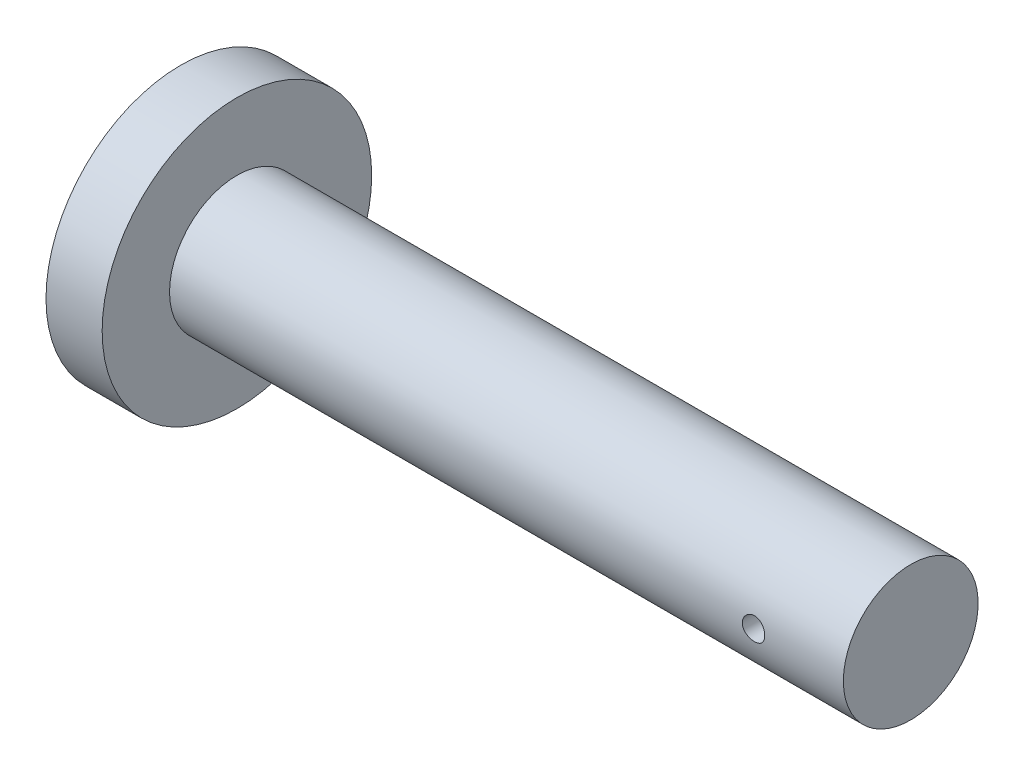
ISO-10303-21;
HEADER;
FILE_DESCRIPTION(('STEP AP214'),'2;1');
FILE_NAME('part.step','',(''),(''),'','','');
FILE_SCHEMA(('AUTOMOTIVE_DESIGN { 1 0 10303 214 1 1 1 1 }'));
ENDSEC;
DATA;
#1=APPLICATION_CONTEXT('core data for automotive mechanical design processes');
#2=APPLICATION_PROTOCOL_DEFINITION('international standard','automotive_design',2000,#1);
#3=PRODUCT_CONTEXT('',#1,'mechanical');
#4=PRODUCT('Part','Part','',(#3));
#5=PRODUCT_RELATED_PRODUCT_CATEGORY('part','',(#4));
#6=PRODUCT_DEFINITION_FORMATION('','',#4);
#7=PRODUCT_DEFINITION_CONTEXT('part definition',#1,'design');
#8=PRODUCT_DEFINITION('design','',#6,#7);
#9=PRODUCT_DEFINITION_SHAPE('','',#8);
#10=(LENGTH_UNIT() NAMED_UNIT(*) SI_UNIT(.MILLI.,.METRE.));
#11=(NAMED_UNIT(*) PLANE_ANGLE_UNIT() SI_UNIT($,.RADIAN.));
#12=(NAMED_UNIT(*) SI_UNIT($,.STERADIAN.) SOLID_ANGLE_UNIT());
#13=UNCERTAINTY_MEASURE_WITH_UNIT(LENGTH_MEASURE(1.E-05),#10,'distance_accuracy_value','');
#14=(GEOMETRIC_REPRESENTATION_CONTEXT(3) GLOBAL_UNCERTAINTY_ASSIGNED_CONTEXT((#13)) GLOBAL_UNIT_ASSIGNED_CONTEXT((#10,
#11,#12)) REPRESENTATION_CONTEXT('',''));
#15=CARTESIAN_POINT('',(0.,0.,0.));
#16=DIRECTION('',(0.,0.,1.));
#17=DIRECTION('',(1.,0.,0.));
#18=AXIS2_PLACEMENT_3D('',#15,#16,#17);
#19=CARTESIAN_POINT('',(0.,0.,0.));
#20=DIRECTION('',(-1.,0.,0.));
#21=DIRECTION('',(0.,0.,1.));
#22=AXIS2_PLACEMENT_3D('',#19,#20,#21);
#23=CYLINDRICAL_SURFACE('',#22,12.);
#24=CARTESIAN_POINT('',(-27.9859154929612,0.,0.));
#25=DIRECTION('',(-1.,0.,0.));
#26=DIRECTION('',(0.,0.,1.));
#27=AXIS2_PLACEMENT_3D('',#24,#25,#26);
#28=CIRCLE('',#27,12.);
#29=CARTESIAN_POINT('',(-27.9859154929612,0.,12.));
#30=VERTEX_POINT('',#29);
#31=EDGE_CURVE('E87',#30,#30,#28,.T.);
#32=ORIENTED_EDGE('',*,*,#31,.F.);
#33=EDGE_LOOP('',(#32));
#34=FACE_BOUND('',#33,.T.);
#35=CARTESIAN_POINT('',(-22.9859154929612,0.,0.));
#36=DIRECTION('',(-1.,0.,0.));
#37=DIRECTION('',(0.,0.,1.));
#38=AXIS2_PLACEMENT_3D('',#35,#36,#37);
#39=CIRCLE('',#38,12.);
#40=CARTESIAN_POINT('',(-22.9859154929612,0.,12.));
#41=VERTEX_POINT('',#40);
#42=EDGE_CURVE('E10',#41,#41,#39,.T.);
#43=ORIENTED_EDGE('',*,*,#42,.T.);
#44=EDGE_LOOP('',(#43));
#45=FACE_BOUND('',#44,.T.);
#46=ADVANCED_FACE('F33',(#34,#45),#23,.T.);
#47=CARTESIAN_POINT('',(-22.9859154929612,12.,0.));
#48=DIRECTION('',(-1.,0.,0.));
#49=DIRECTION('',(0.,0.,1.));
#50=AXIS2_PLACEMENT_3D('',#47,#48,#49);
#51=PLANE('',#50);
#52=ORIENTED_EDGE('',*,*,#42,.F.);
#53=EDGE_LOOP('',(#52));
#54=FACE_BOUND('',#53,.T.);
#55=CARTESIAN_POINT('',(-22.9859154929612,0.,0.));
#56=DIRECTION('',(-1.,0.,0.));
#57=DIRECTION('',(0.,0.,1.));
#58=AXIS2_PLACEMENT_3D('',#55,#56,#57);
#59=CIRCLE('',#58,6.);
#60=CARTESIAN_POINT('',(-22.9859154929612,0.,6.));
#61=VERTEX_POINT('',#60);
#62=EDGE_CURVE('E45',#61,#61,#59,.T.);
#63=ORIENTED_EDGE('',*,*,#62,.T.);
#64=EDGE_LOOP('',(#63));
#65=FACE_BOUND('',#64,.T.);
#66=ADVANCED_FACE('F76',(#54,#65),#51,.F.);
#67=CARTESIAN_POINT('',(0.,0.,0.));
#68=DIRECTION('',(-1.,0.,0.));
#69=DIRECTION('',(0.,0.,1.));
#70=AXIS2_PLACEMENT_3D('',#67,#68,#69);
#71=CYLINDRICAL_SURFACE('',#70,6.);
#72=CARTESIAN_POINT('',(30.0140845070388,0.,6.));
#73=CARTESIAN_POINT('',(30.0140822714596,-0.0557563619832857,5.99999904467529));
#74=CARTESIAN_POINT('',(30.0094055970512,-0.111543152735528,5.99921471165214));
#75=CARTESIAN_POINT('',(29.9908302435326,-0.221552088669217,5.99616137976555));
#76=CARTESIAN_POINT('',(29.9769230842741,-0.275772747183699,5.99389101569556));
#77=CARTESIAN_POINT('',(29.9403183276017,-0.381041898885059,5.9881202729458));
#78=CARTESIAN_POINT('',(29.9176279207825,-0.432092947372762,5.98462090063677));
#79=CARTESIAN_POINT('',(29.8641195902178,-0.52965673679118,5.97677690832828));
#80=CARTESIAN_POINT('',(29.8333025960456,-0.576169995951438,5.97243238501774));
#81=CARTESIAN_POINT('',(29.7641024735106,-0.663789045716673,5.96333326983325));
#82=CARTESIAN_POINT('',(29.7256568611843,-0.704845161413988,5.95857548725943));
#83=CARTESIAN_POINT('',(29.6424253196496,-0.779955399463972,5.94921050750693));
#84=CARTESIAN_POINT('',(29.5976389904561,-0.814009079756389,5.94460331985067));
#85=CARTESIAN_POINT('',(29.5026561205599,-0.874346850242053,5.93603026303912));
#86=CARTESIAN_POINT('',(29.4524279723169,-0.900581821144401,5.93206851636654));
#87=CARTESIAN_POINT('',(29.3482006813185,-0.944223346164488,5.9252791591787));
#88=CARTESIAN_POINT('',(29.2942017935677,-0.961630496626246,5.92245147205723));
#89=CARTESIAN_POINT('',(29.1844923970961,-0.986965751113925,5.91828214737102));
#90=CARTESIAN_POINT('',(29.1288022124382,-0.994979611654162,5.9169270739428));
#91=CARTESIAN_POINT('',(29.0168523962854,-1.00156669011595,5.9158157557466));
#92=CARTESIAN_POINT('',(28.9605928053718,-1.0001405761556,5.91605939782886));
#93=CARTESIAN_POINT('',(28.8497133625286,-0.987958039358463,5.91810571545422));
#94=CARTESIAN_POINT('',(28.7950825856207,-0.97729795275591,5.91989229327567));
#95=CARTESIAN_POINT('',(28.6883959799071,-0.947101256161379,5.92479798084403));
#96=CARTESIAN_POINT('',(28.6363402394833,-0.927564341727898,5.92791713629309));
#97=CARTESIAN_POINT('',(28.5359929776624,-0.880070898437567,5.9351539173364));
#98=CARTESIAN_POINT('',(28.4877207446063,-0.852074365551888,5.9392762684293));
#99=CARTESIAN_POINT('',(28.3965227468234,-0.788484807022975,5.94805167366003));
#100=CARTESIAN_POINT('',(28.3535974140568,-0.752891168261716,5.95270477061714));
#101=CARTESIAN_POINT('',(28.2737540727158,-0.674592884863623,5.96208811151914));
#102=CARTESIAN_POINT('',(28.2369170996227,-0.631805585549252,5.96681859692661));
#103=CARTESIAN_POINT('',(28.1709334019726,-0.54061409959266,5.97577040558689));
#104=CARTESIAN_POINT('',(28.1417867269655,-0.492209876762569,5.97999172555898));
#105=CARTESIAN_POINT('',(28.0920036161842,-0.391082366466685,5.98745557157165));
#106=CARTESIAN_POINT('',(28.0713743393063,-0.338355490225865,5.99069727362979));
#107=CARTESIAN_POINT('',(28.0392868209404,-0.230119338241094,5.99583001205064));
#108=CARTESIAN_POINT('',(28.0278278122493,-0.174610295671789,5.9977211614019));
#109=CARTESIAN_POINT('',(28.0145159636543,-0.0630839605206509,5.99992451937074));
#110=CARTESIAN_POINT('',(28.0125518783165,-0.00708029486040566,6.00025501205114));
#111=CARTESIAN_POINT('',(28.01798904481,0.104455909155954,5.99934989768468));
#112=CARTESIAN_POINT('',(28.0253899362923,0.159988465556816,5.99811435089647));
#113=CARTESIAN_POINT('',(28.0492544467729,0.268662470218706,5.99422730775281));
#114=CARTESIAN_POINT('',(28.0656629903948,0.321816347354152,5.99158441920524));
#115=CARTESIAN_POINT('',(28.1070183143186,0.424618753944178,5.98517785782143));
#116=CARTESIAN_POINT('',(28.1319655740929,0.474267086363889,5.98141412204808));
#117=CARTESIAN_POINT('',(28.1899449569175,0.569132275787585,5.97313806520963));
#118=CARTESIAN_POINT('',(28.2230465695057,0.614306100374861,5.96861942354809));
#119=CARTESIAN_POINT('',(28.2962994331928,0.698497434201076,5.9593538695676));
#120=CARTESIAN_POINT('',(28.3364511963494,0.737514495878634,5.95460694068619));
#121=CARTESIAN_POINT('',(28.4231635262673,0.808697111863203,5.94536070094338));
#122=CARTESIAN_POINT('',(28.4697861732445,0.84078750444549,5.94086446454842));
#123=CARTESIAN_POINT('',(28.5678256946942,0.896680924117997,5.93268611911154));
#124=CARTESIAN_POINT('',(28.6192424171298,0.920484213907931,5.92900398426408));
#125=CARTESIAN_POINT('',(28.7252004001636,0.959015332589262,5.92289381479082));
#126=CARTESIAN_POINT('',(28.779727745051,0.973780573019181,5.92046061724426));
#127=CARTESIAN_POINT('',(28.8905325587275,0.993934181511313,5.91711086734104));
#128=CARTESIAN_POINT('',(28.9468098749316,0.999323364778469,5.91619418313089));
#129=CARTESIAN_POINT('',(29.0587665734237,1.00054914641894,5.91598693233605));
#130=CARTESIAN_POINT('',(29.1144446584689,0.996504054450076,5.9166762260226));
#131=CARTESIAN_POINT('',(29.2243162062591,0.97923193558274,5.91955912581491));
#132=CARTESIAN_POINT('',(29.2785096738155,0.966004938444992,5.92175272704486));
#133=CARTESIAN_POINT('',(29.3838278819558,0.930789795837962,5.92738942512687));
#134=CARTESIAN_POINT('',(29.4349561110612,0.908811836240179,5.93083106887868));
#135=CARTESIAN_POINT('',(29.5328187747167,0.856730801566366,5.93857747568883));
#136=CARTESIAN_POINT('',(29.5795529911876,0.826627323499428,5.9428822815536));
#137=CARTESIAN_POINT('',(29.6678987402819,0.758727553748865,5.95193381618249));
#138=CARTESIAN_POINT('',(29.7094429137189,0.720844225437461,5.95668518230521));
#139=CARTESIAN_POINT('',(29.7856251488287,0.638643612552094,5.96605748944336));
#140=CARTESIAN_POINT('',(29.820261614494,0.594324845165056,5.97067840010619));
#141=CARTESIAN_POINT('',(29.8818638143187,0.500147667856115,5.97930611856888));
#142=CARTESIAN_POINT('',(29.9087749227639,0.450253115013129,5.98330846501242));
#143=CARTESIAN_POINT('',(29.9537923008827,0.346605227751594,5.9902046704071));
#144=CARTESIAN_POINT('',(29.9719073394706,0.292855797932006,5.99309963270993));
#145=CARTESIAN_POINT('',(29.9948866166894,0.199081324018161,5.99682316333182));
#146=CARTESIAN_POINT('',(30.0020742948851,0.15962353211938,5.99800810909344));
#147=CARTESIAN_POINT('',(30.0116740021767,0.0801157241279236,5.99959686394448));
#148=CARTESIAN_POINT('',(30.0140861134937,0.0400657182433977,6.00000068648257));
#149=CARTESIAN_POINT('',(30.0140845070388,0.,6.));
#150=B_SPLINE_CURVE_WITH_KNOTS('',3,(#72,#73,#74,#75,#76,#77,#78,#79,#80,#81,#82,#83,#84,#85,
#86,#87,#88,#89,#90,#91,#92,#93,#94,#95,#96,#97,#98,#99,#100,#101,#102,#103,#104,#105,#106,#107,
#108,#109,#110,#111,#112,#113,#114,#115,#116,#117,#118,#119,#120,#121,#122,#123,#124,#125,#126,
#127,#128,#129,#130,#131,#132,#133,#134,#135,#136,#137,#138,#139,#140,#141,#142,#143,#144,#145,
#146,#147,#148,#149),.UNSPECIFIED.,.T.,.F.,(4,2,2,2,2,2,2,2,2,2,2,2,2,2,2,2,2,2,2,2,2,2,2,2,2,2,
2,2,2,2,2,2,2,2,2,2,2,2,4),(0.,0.167122633975404,0.33439901827817,0.501538746810112,
0.668659365069919,0.83720996424933,1.00577120067943,1.17537008329536,1.34495750750473,
1.5129843084137,1.68099921728355,1.84728208704164,2.01357066010153,2.18065822653023,
2.3477592827223,2.51693107964531,2.6861039665434,2.85541875566362,3.0247193780846,
3.19203153396559,3.35933725214344,3.52563122802567,3.69193454330427,3.8597073025081,
4.02749225221714,4.19701528803049,4.36653294950378,4.5353440893671,4.70414055114648,
4.87083163809081,5.03752218475254,5.2040192729049,5.37052462011735,5.53900553677358,
5.7075253355159,5.87720892642881,6.0467230085203,6.16681699265608,6.28690890910788),.UNSPECIFIED.);
#151=CARTESIAN_POINT('',(30.0140845070388,0.,6.));
#152=VERTEX_POINT('',#151);
#153=EDGE_CURVE('E36',#152,#152,#150,.T.);
#154=ORIENTED_EDGE('',*,*,#153,.T.);
#155=EDGE_LOOP('',(#154));
#156=FACE_BOUND('',#155,.T.);
#157=CARTESIAN_POINT('',(30.0140845070388,0.,-6.));
#158=CARTESIAN_POINT('',(30.0140822714596,0.0557563619832862,-5.99999904467529));
#159=CARTESIAN_POINT('',(30.0094055970512,0.111543152735529,-5.99921471165214));
#160=CARTESIAN_POINT('',(29.9908302435326,0.221552088669218,-5.99616137976555));
#161=CARTESIAN_POINT('',(29.9769230842741,0.275772747183699,-5.99389101569556));
#162=CARTESIAN_POINT('',(29.9403183276017,0.381041898885057,-5.9881202729458));
#163=CARTESIAN_POINT('',(29.9176279207825,0.43209294737276,-5.98462090063677));
#164=CARTESIAN_POINT('',(29.8641195902178,0.529656736791178,-5.97677690832828));
#165=CARTESIAN_POINT('',(29.8333025960456,0.576169995951436,-5.97243238501774));
#166=CARTESIAN_POINT('',(29.7641024735106,0.663789045716673,-5.96333326983325));
#167=CARTESIAN_POINT('',(29.7256568611843,0.704845161413988,-5.95857548725943));
#168=CARTESIAN_POINT('',(29.6424253196496,0.779955399463972,-5.94921050750693));
#169=CARTESIAN_POINT('',(29.5976389904561,0.814009079756389,-5.94460331985067));
#170=CARTESIAN_POINT('',(29.5026561205599,0.874346850242053,-5.93603026303912));
#171=CARTESIAN_POINT('',(29.4524279723169,0.900581821144401,-5.93206851636654));
#172=CARTESIAN_POINT('',(29.3482006813185,0.944223346164488,-5.9252791591787));
#173=CARTESIAN_POINT('',(29.2942017935677,0.961630496626246,-5.92245147205723));
#174=CARTESIAN_POINT('',(29.1844923970961,0.986965751113925,-5.91828214737102));
#175=CARTESIAN_POINT('',(29.1288022124382,0.994979611654162,-5.9169270739428));
#176=CARTESIAN_POINT('',(29.0168523962854,1.00156669011595,-5.9158157557466));
#177=CARTESIAN_POINT('',(28.9605928053718,1.0001405761556,-5.91605939782886));
#178=CARTESIAN_POINT('',(28.8497133625286,0.987958039358462,-5.91810571545422));
#179=CARTESIAN_POINT('',(28.7950825856207,0.97729795275591,-5.91989229327567));
#180=CARTESIAN_POINT('',(28.6883959799071,0.947101256161379,-5.92479798084403));
#181=CARTESIAN_POINT('',(28.6363402394833,0.927564341727898,-5.92791713629309));
#182=CARTESIAN_POINT('',(28.5359929776624,0.880070898437567,-5.9351539173364));
#183=CARTESIAN_POINT('',(28.4877207446063,0.852074365551888,-5.9392762684293));
#184=CARTESIAN_POINT('',(28.3965227468234,0.788484807022975,-5.94805167366003));
#185=CARTESIAN_POINT('',(28.3535974140568,0.752891168261716,-5.95270477061714));
#186=CARTESIAN_POINT('',(28.2737540727158,0.674592884863623,-5.96208811151914));
#187=CARTESIAN_POINT('',(28.2369170996227,0.631805585549252,-5.96681859692661));
#188=CARTESIAN_POINT('',(28.1709334019726,0.54061409959266,-5.97577040558689));
#189=CARTESIAN_POINT('',(28.1417867269655,0.492209876762569,-5.97999172555898));
#190=CARTESIAN_POINT('',(28.0920036161842,0.391082366466685,-5.98745557157165));
#191=CARTESIAN_POINT('',(28.0713743393063,0.338355490225865,-5.99069727362979));
#192=CARTESIAN_POINT('',(28.0392868209404,0.230119338241094,-5.99583001205064));
#193=CARTESIAN_POINT('',(28.0278278122493,0.174610295671789,-5.9977211614019));
#194=CARTESIAN_POINT('',(28.0145159636543,0.063083960520651,-5.99992451937074));
#195=CARTESIAN_POINT('',(28.0125518783165,0.00708029486040593,-6.00025501205114));
#196=CARTESIAN_POINT('',(28.01798904481,-0.104455909155954,-5.99934989768468));
#197=CARTESIAN_POINT('',(28.0253899362923,-0.159988465556815,-5.99811435089647));
#198=CARTESIAN_POINT('',(28.0492544467729,-0.268662470218705,-5.99422730775281));
#199=CARTESIAN_POINT('',(28.0656629903948,-0.321816347354151,-5.99158441920524));
#200=CARTESIAN_POINT('',(28.1070183143186,-0.424618753944176,-5.98517785782143));
#201=CARTESIAN_POINT('',(28.1319655740929,-0.474267086363888,-5.98141412204808));
#202=CARTESIAN_POINT('',(28.1899449569175,-0.569132275787584,-5.97313806520963));
#203=CARTESIAN_POINT('',(28.2230465695057,-0.614306100374859,-5.96861942354809));
#204=CARTESIAN_POINT('',(28.2962994331928,-0.698497434201075,-5.9593538695676));
#205=CARTESIAN_POINT('',(28.3364511963494,-0.737514495878634,-5.95460694068619));
#206=CARTESIAN_POINT('',(28.4231635262673,-0.808697111863201,-5.94536070094338));
#207=CARTESIAN_POINT('',(28.4697861732445,-0.840787504445487,-5.94086446454842));
#208=CARTESIAN_POINT('',(28.5678256946942,-0.896680924117995,-5.93268611911154));
#209=CARTESIAN_POINT('',(28.6192424171298,-0.92048421390793,-5.92900398426408));
#210=CARTESIAN_POINT('',(28.7252004001636,-0.95901533258926,-5.92289381479082));
#211=CARTESIAN_POINT('',(28.779727745051,-0.973780573019179,-5.92046061724426));
#212=CARTESIAN_POINT('',(28.8905325587275,-0.993934181511312,-5.91711086734104));
#213=CARTESIAN_POINT('',(28.9468098749316,-0.999323364778469,-5.91619418313089));
#214=CARTESIAN_POINT('',(29.0587665734237,-1.00054914641894,-5.91598693233605));
#215=CARTESIAN_POINT('',(29.1144446584689,-0.996504054450076,-5.9166762260226));
#216=CARTESIAN_POINT('',(29.2243162062591,-0.979231935582742,-5.91955912581491));
#217=CARTESIAN_POINT('',(29.2785096738155,-0.966004938444993,-5.92175272704486));
#218=CARTESIAN_POINT('',(29.3838278819558,-0.930789795837963,-5.92738942512687));
#219=CARTESIAN_POINT('',(29.4349561110612,-0.908811836240179,-5.93083106887868));
#220=CARTESIAN_POINT('',(29.5328187747167,-0.856730801566366,-5.93857747568883));
#221=CARTESIAN_POINT('',(29.5795529911876,-0.826627323499428,-5.9428822815536));
#222=CARTESIAN_POINT('',(29.6678987402819,-0.758727553748865,-5.95193381618249));
#223=CARTESIAN_POINT('',(29.7094429137189,-0.720844225437461,-5.95668518230521));
#224=CARTESIAN_POINT('',(29.7856251488287,-0.638643612552094,-5.96605748944336));
#225=CARTESIAN_POINT('',(29.820261614494,-0.594324845165056,-5.97067840010619));
#226=CARTESIAN_POINT('',(29.8818638143187,-0.500147667856115,-5.97930611856888));
#227=CARTESIAN_POINT('',(29.9087749227639,-0.450253115013129,-5.98330846501242));
#228=CARTESIAN_POINT('',(29.9537923008827,-0.346605227751594,-5.9902046704071));
#229=CARTESIAN_POINT('',(29.9719073394706,-0.292855797932006,-5.99309963270993));
#230=CARTESIAN_POINT('',(29.9948866166894,-0.199081324018162,-5.99682316333182));
#231=CARTESIAN_POINT('',(30.0020742948851,-0.15962353211938,-5.99800810909344));
#232=CARTESIAN_POINT('',(30.0116740021767,-0.0801157241279243,-5.99959686394448));
#233=CARTESIAN_POINT('',(30.0140861134937,-0.040065718243398,-6.00000068648257));
#234=CARTESIAN_POINT('',(30.0140845070388,0.,-6.));
#235=B_SPLINE_CURVE_WITH_KNOTS('',3,(#157,#158,#159,#160,#161,#162,#163,#164,#165,#166,#167,
#168,#169,#170,#171,#172,#173,#174,#175,#176,#177,#178,#179,#180,#181,#182,#183,#184,#185,#186,
#187,#188,#189,#190,#191,#192,#193,#194,#195,#196,#197,#198,#199,#200,#201,#202,#203,#204,#205,
#206,#207,#208,#209,#210,#211,#212,#213,#214,#215,#216,#217,#218,#219,#220,#221,#222,#223,#224,
#225,#226,#227,#228,#229,#230,#231,#232,#233,#234),.UNSPECIFIED.,.T.,.F.,(4,2,2,2,2,2,2,2,2,2,2,
2,2,2,2,2,2,2,2,2,2,2,2,2,2,2,2,2,2,2,2,2,2,2,2,2,2,2,4),(0.,0.167122633975404,
0.334399018278169,0.501538746810107,0.668659365069918,0.837209964249329,1.00577120067943,
1.17537008329536,1.34495750750473,1.5129843084137,1.68099921728355,1.84728208704164,
2.01357066010153,2.18065822653023,2.3477592827223,2.51693107964531,2.6861039665434,
2.85541875566362,3.0247193780846,3.19203153396559,3.35933725214344,3.52563122802567,
3.69193454330427,3.8597073025081,4.02749225221714,4.19701528803048,4.36653294950378,
4.53534408936709,4.70414055114647,4.8708316380908,5.03752218475254,5.2040192729049,
5.37052462011735,5.53900553677357,5.7075253355159,5.87720892642881,6.04672300852029,
6.16681699265608,6.28690890910788),.UNSPECIFIED.);
#236=CARTESIAN_POINT('',(30.0140845070388,0.,-6.));
#237=VERTEX_POINT('',#236);
#238=EDGE_CURVE('E53',#237,#237,#235,.T.);
#239=ORIENTED_EDGE('',*,*,#238,.T.);
#240=EDGE_LOOP('',(#239));
#241=FACE_BOUND('',#240,.T.);
#242=ORIENTED_EDGE('',*,*,#62,.F.);
#243=EDGE_LOOP('',(#242));
#244=FACE_BOUND('',#243,.T.);
#245=CARTESIAN_POINT('',(37.0140845070388,0.,0.));
#246=DIRECTION('',(-1.,0.,0.));
#247=DIRECTION('',(0.,0.,1.));
#248=AXIS2_PLACEMENT_3D('',#245,#246,#247);
#249=CIRCLE('',#248,6.);
#250=CARTESIAN_POINT('',(37.0140845070388,0.,6.));
#251=VERTEX_POINT('',#250);
#252=EDGE_CURVE('E50',#251,#251,#249,.T.);
#253=ORIENTED_EDGE('',*,*,#252,.T.);
#254=EDGE_LOOP('',(#253));
#255=FACE_BOUND('',#254,.T.);
#256=ADVANCED_FACE('F58',(#156,#241,#244,#255),#71,.T.);
#257=CARTESIAN_POINT('',(37.0140845070388,6.,0.));
#258=DIRECTION('',(-1.,0.,0.));
#259=DIRECTION('',(0.,0.,1.));
#260=AXIS2_PLACEMENT_3D('',#257,#258,#259);
#261=PLANE('',#260);
#262=ORIENTED_EDGE('',*,*,#252,.F.);
#263=EDGE_LOOP('',(#262));
#264=FACE_BOUND('',#263,.T.);
#265=ADVANCED_FACE('F69',(#264),#261,.F.);
#266=CARTESIAN_POINT('',(-27.9859154929612,12.,0.));
#267=DIRECTION('',(1.,0.,0.));
#268=DIRECTION('',(0.,0.,-1.));
#269=AXIS2_PLACEMENT_3D('',#266,#267,#268);
#270=PLANE('',#269);
#271=ORIENTED_EDGE('',*,*,#31,.T.);
#272=EDGE_LOOP('',(#271));
#273=FACE_BOUND('',#272,.T.);
#274=ADVANCED_FACE('F65',(#273),#270,.F.);
#275=CARTESIAN_POINT('',(29.0140845070388,0.,-12.));
#276=DIRECTION('',(0.,0.,1.));
#277=DIRECTION('',(1.,0.,0.));
#278=AXIS2_PLACEMENT_3D('',#275,#276,#277);
#279=CYLINDRICAL_SURFACE('',#278,1.);
#280=ORIENTED_EDGE('',*,*,#238,.F.);
#281=EDGE_LOOP('',(#280));
#282=FACE_BOUND('',#281,.T.);
#283=ORIENTED_EDGE('',*,*,#153,.F.);
#284=EDGE_LOOP('',(#283));
#285=FACE_BOUND('',#284,.T.);
#286=ADVANCED_FACE('F61',(#282,#285),#279,.F.);
#287=CLOSED_SHELL('',(#46,#66,#256,#265,#274,#286));
#288=MANIFOLD_SOLID_BREP('B2',#287);
#289=ADVANCED_BREP_SHAPE_REPRESENTATION('',(#18,#288),#14);
#290=SHAPE_DEFINITION_REPRESENTATION(#9,#289);
ENDSEC;
END-ISO-10303-21;
